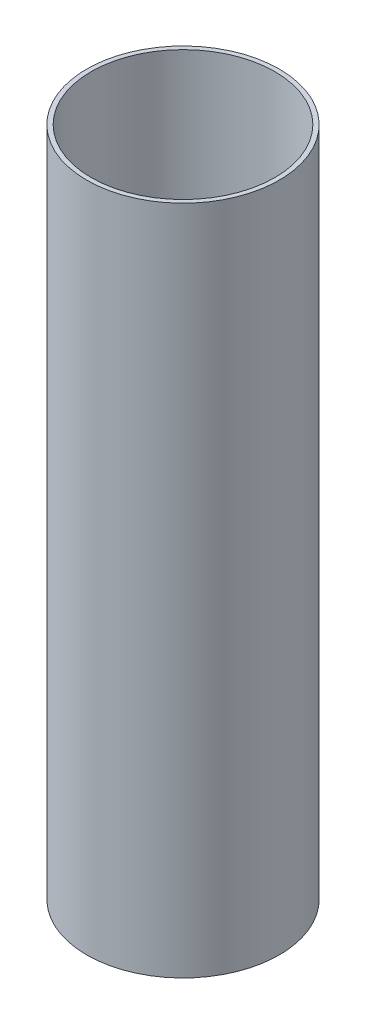
ISO-10303-21;
HEADER;
FILE_DESCRIPTION(('STEP AP214'),'2;1');
FILE_NAME('part.step','',(''),(''),'','','');
FILE_SCHEMA(('AUTOMOTIVE_DESIGN { 1 0 10303 214 1 1 1 1 }'));
ENDSEC;
DATA;
#1=APPLICATION_CONTEXT('core data for automotive mechanical design processes');
#2=APPLICATION_PROTOCOL_DEFINITION('international standard','automotive_design',2000,#1);
#3=PRODUCT_CONTEXT('',#1,'mechanical');
#4=PRODUCT('Part','Part','',(#3));
#5=PRODUCT_RELATED_PRODUCT_CATEGORY('part','',(#4));
#6=PRODUCT_DEFINITION_FORMATION('','',#4);
#7=PRODUCT_DEFINITION_CONTEXT('part definition',#1,'design');
#8=PRODUCT_DEFINITION('design','',#6,#7);
#9=PRODUCT_DEFINITION_SHAPE('','',#8);
#10=(LENGTH_UNIT() NAMED_UNIT(*) SI_UNIT(.MILLI.,.METRE.));
#11=(NAMED_UNIT(*) PLANE_ANGLE_UNIT() SI_UNIT($,.RADIAN.));
#12=(NAMED_UNIT(*) SI_UNIT($,.STERADIAN.) SOLID_ANGLE_UNIT());
#13=UNCERTAINTY_MEASURE_WITH_UNIT(LENGTH_MEASURE(1.E-05),#10,'distance_accuracy_value','');
#14=(GEOMETRIC_REPRESENTATION_CONTEXT(3) GLOBAL_UNCERTAINTY_ASSIGNED_CONTEXT((#13)) GLOBAL_UNIT_ASSIGNED_CONTEXT((#10,
#11,#12)) REPRESENTATION_CONTEXT('',''));
#15=CARTESIAN_POINT('',(0.,0.,0.));
#16=DIRECTION('',(0.,0.,1.));
#17=DIRECTION('',(1.,0.,0.));
#18=AXIS2_PLACEMENT_3D('',#15,#16,#17);
#19=CARTESIAN_POINT('',(62.0000000000002,226.5,0.));
#20=DIRECTION('',(0.,1.,0.));
#21=DIRECTION('',(0.,0.,1.));
#22=AXIS2_PLACEMENT_3D('',#19,#20,#21);
#23=PLANE('',#22);
#24=CARTESIAN_POINT('',(-2.22044604925031E-13,226.5,0.));
#25=DIRECTION('',(0.,1.,0.));
#26=DIRECTION('',(0.,0.,1.));
#27=AXIS2_PLACEMENT_3D('',#24,#25,#26);
#28=CIRCLE('',#27,65.0000000000004);
#29=CARTESIAN_POINT('',(-2.22044604925031E-13,226.5,65.0000000000004));
#30=VERTEX_POINT('',#29);
#31=EDGE_CURVE('E10',#30,#30,#28,.T.);
#32=ORIENTED_EDGE('',*,*,#31,.T.);
#33=EDGE_LOOP('',(#32));
#34=FACE_BOUND('',#33,.T.);
#35=CARTESIAN_POINT('',(-2.22044604925031E-13,226.5,0.));
#36=DIRECTION('',(0.,1.,0.));
#37=DIRECTION('',(0.,0.,1.));
#38=AXIS2_PLACEMENT_3D('',#35,#36,#37);
#39=CIRCLE('',#38,62.0000000000004);
#40=CARTESIAN_POINT('',(-2.22044604925031E-13,226.5,62.0000000000004));
#41=VERTEX_POINT('',#40);
#42=EDGE_CURVE('E62',#41,#41,#39,.T.);
#43=ORIENTED_EDGE('',*,*,#42,.F.);
#44=EDGE_LOOP('',(#43));
#45=FACE_BOUND('',#44,.T.);
#46=ADVANCED_FACE('F43',(#34,#45),#23,.T.);
#47=CARTESIAN_POINT('',(-2.22044604925031E-13,150.,0.));
#48=DIRECTION('',(0.,1.,0.));
#49=DIRECTION('',(0.,0.,1.));
#50=AXIS2_PLACEMENT_3D('',#47,#48,#49);
#51=CYLINDRICAL_SURFACE('',#50,65.0000000000004);
#52=CARTESIAN_POINT('',(-2.22044604925031E-13,-226.5,0.));
#53=DIRECTION('',(0.,1.,0.));
#54=DIRECTION('',(0.,0.,1.));
#55=AXIS2_PLACEMENT_3D('',#52,#53,#54);
#56=CIRCLE('',#55,65.0000000000004);
#57=CARTESIAN_POINT('',(-2.22044604925031E-13,-226.5,65.0000000000004));
#58=VERTEX_POINT('',#57);
#59=EDGE_CURVE('E50',#58,#58,#56,.T.);
#60=ORIENTED_EDGE('',*,*,#59,.T.);
#61=EDGE_LOOP('',(#60));
#62=FACE_BOUND('',#61,.T.);
#63=ORIENTED_EDGE('',*,*,#31,.F.);
#64=EDGE_LOOP('',(#63));
#65=FACE_BOUND('',#64,.T.);
#66=ADVANCED_FACE('F73',(#62,#65),#51,.T.);
#67=CARTESIAN_POINT('',(62.0000000000002,-226.5,0.));
#68=DIRECTION('',(0.,1.,0.));
#69=DIRECTION('',(0.,0.,1.));
#70=AXIS2_PLACEMENT_3D('',#67,#68,#69);
#71=PLANE('',#70);
#72=ORIENTED_EDGE('',*,*,#59,.F.);
#73=EDGE_LOOP('',(#72));
#74=FACE_BOUND('',#73,.T.);
#75=CARTESIAN_POINT('',(-2.22044604925031E-13,-226.5,0.));
#76=DIRECTION('',(0.,1.,0.));
#77=DIRECTION('',(0.,0.,1.));
#78=AXIS2_PLACEMENT_3D('',#75,#76,#77);
#79=CIRCLE('',#78,62.0000000000004);
#80=CARTESIAN_POINT('',(-2.22044604925031E-13,-226.5,62.0000000000004));
#81=VERTEX_POINT('',#80);
#82=EDGE_CURVE('E56',#81,#81,#79,.T.);
#83=ORIENTED_EDGE('',*,*,#82,.T.);
#84=EDGE_LOOP('',(#83));
#85=FACE_BOUND('',#84,.T.);
#86=ADVANCED_FACE('F77',(#74,#85),#71,.F.);
#87=CARTESIAN_POINT('',(-2.22044604925031E-13,150.,0.));
#88=DIRECTION('',(0.,1.,0.));
#89=DIRECTION('',(0.,0.,1.));
#90=AXIS2_PLACEMENT_3D('',#87,#88,#89);
#91=CYLINDRICAL_SURFACE('',#90,62.0000000000004);
#92=ORIENTED_EDGE('',*,*,#82,.F.);
#93=EDGE_LOOP('',(#92));
#94=FACE_BOUND('',#93,.T.);
#95=ORIENTED_EDGE('',*,*,#42,.T.);
#96=EDGE_LOOP('',(#95));
#97=FACE_BOUND('',#96,.T.);
#98=ADVANCED_FACE('F70',(#94,#97),#91,.F.);
#99=CLOSED_SHELL('',(#46,#66,#86,#98));
#100=MANIFOLD_SOLID_BREP('B2',#99);
#101=ADVANCED_BREP_SHAPE_REPRESENTATION('',(#18,#100),#14);
#102=SHAPE_DEFINITION_REPRESENTATION(#9,#101);
ENDSEC;
END-ISO-10303-21;
